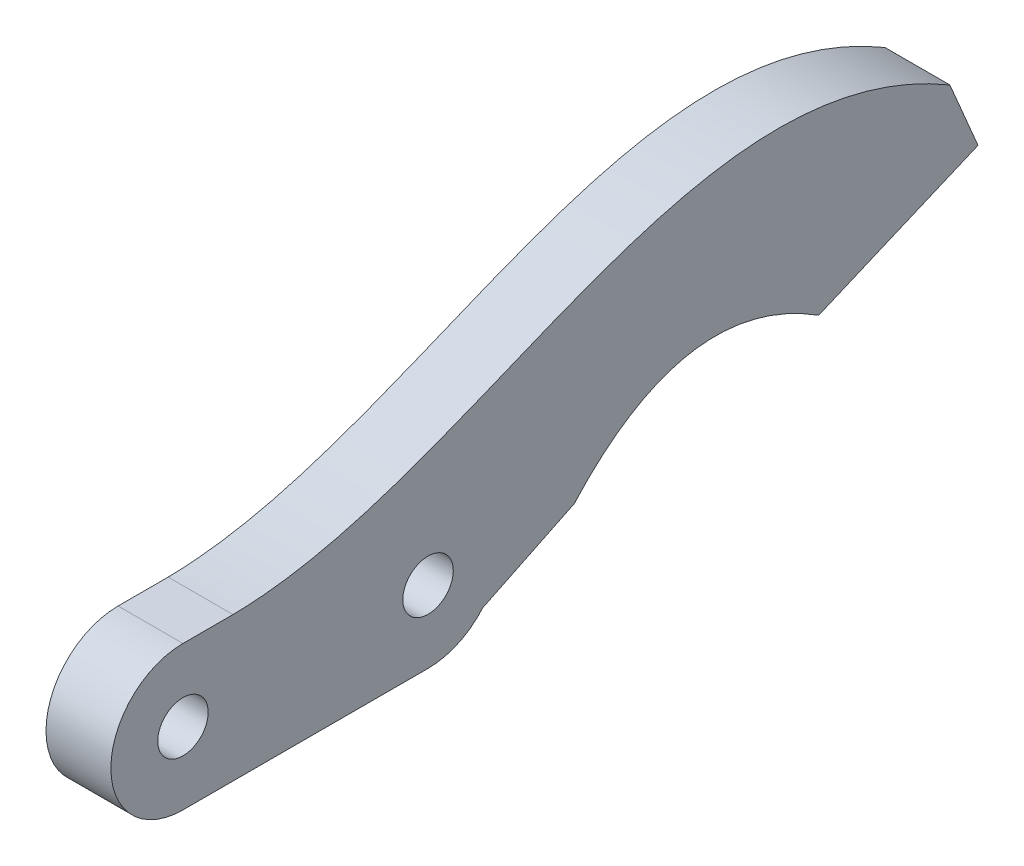
ISO-10303-21;
HEADER;
FILE_DESCRIPTION(('STEP AP214'),'2;1');
FILE_NAME('part.step','',(''),(''),'','','');
FILE_SCHEMA(('AUTOMOTIVE_DESIGN { 1 0 10303 214 1 1 1 1 }'));
ENDSEC;
DATA;
#1=APPLICATION_CONTEXT('core data for automotive mechanical design processes');
#2=APPLICATION_PROTOCOL_DEFINITION('international standard','automotive_design',2000,#1);
#3=PRODUCT_CONTEXT('',#1,'mechanical');
#4=PRODUCT('Part','Part','',(#3));
#5=PRODUCT_RELATED_PRODUCT_CATEGORY('part','',(#4));
#6=PRODUCT_DEFINITION_FORMATION('','',#4);
#7=PRODUCT_DEFINITION_CONTEXT('part definition',#1,'design');
#8=PRODUCT_DEFINITION('design','',#6,#7);
#9=PRODUCT_DEFINITION_SHAPE('','',#8);
#10=(LENGTH_UNIT() NAMED_UNIT(*) SI_UNIT(.MILLI.,.METRE.));
#11=(NAMED_UNIT(*) PLANE_ANGLE_UNIT() SI_UNIT($,.RADIAN.));
#12=(NAMED_UNIT(*) SI_UNIT($,.STERADIAN.) SOLID_ANGLE_UNIT());
#13=UNCERTAINTY_MEASURE_WITH_UNIT(LENGTH_MEASURE(1.E-05),#10,'distance_accuracy_value','');
#14=(GEOMETRIC_REPRESENTATION_CONTEXT(3) GLOBAL_UNCERTAINTY_ASSIGNED_CONTEXT((#13)) GLOBAL_UNIT_ASSIGNED_CONTEXT((#10,
#11,#12)) REPRESENTATION_CONTEXT('',''));
#15=CARTESIAN_POINT('',(0.,0.,0.));
#16=DIRECTION('',(0.,0.,1.));
#17=DIRECTION('',(1.,0.,0.));
#18=AXIS2_PLACEMENT_3D('',#15,#16,#17);
#19=CARTESIAN_POINT('',(4.5,10.,0.));
#20=DIRECTION('',(0.,1.,0.));
#21=DIRECTION('',(0.,0.,1.));
#22=AXIS2_PLACEMENT_3D('',#19,#20,#21);
#23=PLANE('',#22);
#24=DIRECTION('',(1.,0.,0.));
#25=VECTOR('',#24,1.);
#26=CARTESIAN_POINT('',(0.,10.,-8.4718759220508));
#27=LINE('',#26,#25);
#28=CARTESIAN_POINT('',(0.,10.,-8.4718759220508));
#29=VERTEX_POINT('',#28);
#30=CARTESIAN_POINT('',(4.5,10.,-8.4718759220508));
#31=VERTEX_POINT('',#30);
#32=EDGE_CURVE('E134',#29,#31,#27,.T.);
#33=ORIENTED_EDGE('',*,*,#32,.F.);
#34=DIRECTION('',(0.,0.,-1.));
#35=VECTOR('',#34,1.);
#36=CARTESIAN_POINT('',(0.,10.,0.));
#37=LINE('',#36,#35);
#38=CARTESIAN_POINT('',(0.,10.,-5.));
#39=VERTEX_POINT('',#38);
#40=EDGE_CURVE('E145',#39,#29,#37,.T.);
#41=ORIENTED_EDGE('',*,*,#40,.F.);
#42=DIRECTION('',(-1.,0.,0.));
#43=VECTOR('',#42,1.);
#44=CARTESIAN_POINT('',(4.5,10.,-5.));
#45=LINE('',#44,#43);
#46=CARTESIAN_POINT('',(4.5,10.,-5.));
#47=VERTEX_POINT('',#46);
#48=EDGE_CURVE('E11',#47,#39,#45,.T.);
#49=ORIENTED_EDGE('',*,*,#48,.F.);
#50=DIRECTION('',(0.,0.,-1.));
#51=VECTOR('',#50,1.);
#52=CARTESIAN_POINT('',(4.5,10.,0.));
#53=LINE('',#52,#51);
#54=EDGE_CURVE('E202',#47,#31,#53,.T.);
#55=ORIENTED_EDGE('',*,*,#54,.T.);
#56=EDGE_LOOP('',(#33,#41,#49,#55));
#57=FACE_BOUND('',#56,.T.);
#58=ADVANCED_FACE('F43',(#57),#23,.T.);
#59=CARTESIAN_POINT('',(4.5,5.,-5.));
#60=DIRECTION('',(-1.,0.,0.));
#61=DIRECTION('',(0.,0.,1.));
#62=AXIS2_PLACEMENT_3D('',#59,#60,#61);
#63=CYLINDRICAL_SURFACE('',#62,5.);
#64=CARTESIAN_POINT('',(0.,5.,-5.));
#65=DIRECTION('',(1.,0.,0.));
#66=DIRECTION('',(0.,0.,-1.));
#67=AXIS2_PLACEMENT_3D('',#64,#65,#66);
#68=CIRCLE('',#67,5.);
#69=CARTESIAN_POINT('',(0.,0.,-5.));
#70=VERTEX_POINT('',#69);
#71=EDGE_CURVE('E73',#39,#70,#68,.T.);
#72=ORIENTED_EDGE('',*,*,#71,.T.);
#73=DIRECTION('',(-1.,0.,0.));
#74=VECTOR('',#73,1.);
#75=CARTESIAN_POINT('',(4.5,0.,-5.));
#76=LINE('',#75,#74);
#77=CARTESIAN_POINT('',(4.5,0.,-5.));
#78=VERTEX_POINT('',#77);
#79=EDGE_CURVE('E52',#78,#70,#76,.T.);
#80=ORIENTED_EDGE('',*,*,#79,.F.);
#81=CARTESIAN_POINT('',(4.5,5.,-5.));
#82=DIRECTION('',(1.,0.,0.));
#83=DIRECTION('',(0.,0.,-1.));
#84=AXIS2_PLACEMENT_3D('',#81,#82,#83);
#85=CIRCLE('',#84,5.);
#86=EDGE_CURVE('E214',#47,#78,#85,.T.);
#87=ORIENTED_EDGE('',*,*,#86,.F.);
#88=ORIENTED_EDGE('',*,*,#48,.T.);
#89=EDGE_LOOP('',(#72,#80,#87,#88));
#90=FACE_BOUND('',#89,.T.);
#91=ADVANCED_FACE('F194',(#90),#63,.T.);
#92=CARTESIAN_POINT('',(4.5,0.,0.));
#93=DIRECTION('',(0.,1.,0.));
#94=DIRECTION('',(0.,0.,1.));
#95=AXIS2_PLACEMENT_3D('',#92,#93,#94);
#96=PLANE('',#95);
#97=DIRECTION('',(0.,0.,-1.));
#98=VECTOR('',#97,1.);
#99=CARTESIAN_POINT('',(0.,0.,0.));
#100=LINE('',#99,#98);
#101=CARTESIAN_POINT('',(0.,0.,-22.));
#102=VERTEX_POINT('',#101);
#103=EDGE_CURVE('E78',#70,#102,#100,.T.);
#104=ORIENTED_EDGE('',*,*,#103,.T.);
#105=DIRECTION('',(-1.,0.,0.));
#106=VECTOR('',#105,1.);
#107=CARTESIAN_POINT('',(4.5,0.,-22.));
#108=LINE('',#107,#106);
#109=CARTESIAN_POINT('',(4.5,0.,-22.));
#110=VERTEX_POINT('',#109);
#111=EDGE_CURVE('E231',#110,#102,#108,.T.);
#112=ORIENTED_EDGE('',*,*,#111,.F.);
#113=DIRECTION('',(0.,0.,-1.));
#114=VECTOR('',#113,1.);
#115=CARTESIAN_POINT('',(4.5,0.,0.));
#116=LINE('',#115,#114);
#117=EDGE_CURVE('E60',#78,#110,#116,.T.);
#118=ORIENTED_EDGE('',*,*,#117,.F.);
#119=ORIENTED_EDGE('',*,*,#79,.T.);
#120=EDGE_LOOP('',(#104,#112,#118,#119));
#121=FACE_BOUND('',#120,.T.);
#122=ADVANCED_FACE('F188',(#121),#96,.F.);
#123=CARTESIAN_POINT('',(4.5,5.,-5.));
#124=DIRECTION('',(-1.,0.,0.));
#125=DIRECTION('',(0.,0.,1.));
#126=AXIS2_PLACEMENT_3D('',#123,#124,#125);
#127=CYLINDRICAL_SURFACE('',#126,1.75);
#128=CARTESIAN_POINT('',(4.5,5.,-5.));
#129=DIRECTION('',(1.,0.,0.));
#130=DIRECTION('',(0.,0.,-1.));
#131=AXIS2_PLACEMENT_3D('',#128,#129,#130);
#132=CIRCLE('',#131,1.75);
#133=CARTESIAN_POINT('',(4.5,5.,-6.75));
#134=VERTEX_POINT('',#133);
#135=EDGE_CURVE('E223',#134,#134,#132,.T.);
#136=ORIENTED_EDGE('',*,*,#135,.T.);
#137=EDGE_LOOP('',(#136));
#138=FACE_BOUND('',#137,.T.);
#139=CARTESIAN_POINT('',(0.,5.,-5.));
#140=DIRECTION('',(1.,0.,0.));
#141=DIRECTION('',(0.,0.,-1.));
#142=AXIS2_PLACEMENT_3D('',#139,#140,#141);
#143=CIRCLE('',#142,1.75);
#144=CARTESIAN_POINT('',(0.,5.,-6.75));
#145=VERTEX_POINT('',#144);
#146=EDGE_CURVE('E242',#145,#145,#143,.T.);
#147=ORIENTED_EDGE('',*,*,#146,.F.);
#148=EDGE_LOOP('',(#147));
#149=FACE_BOUND('',#148,.T.);
#150=ADVANCED_FACE('F185',(#138,#149),#127,.F.);
#151=CARTESIAN_POINT('',(4.5,5.,-22.));
#152=DIRECTION('',(-1.,0.,0.));
#153=DIRECTION('',(0.,0.,1.));
#154=AXIS2_PLACEMENT_3D('',#151,#152,#153);
#155=CYLINDRICAL_SURFACE('',#154,5.);
#156=CARTESIAN_POINT('',(0.,5.,-22.));
#157=DIRECTION('',(1.,0.,0.));
#158=DIRECTION('',(0.,0.,-1.));
#159=AXIS2_PLACEMENT_3D('',#156,#157,#158);
#160=CIRCLE('',#159,5.);
#161=CARTESIAN_POINT('',(0.,1.74538296746678,-25.7957170563076));
#162=VERTEX_POINT('',#161);
#163=EDGE_CURVE('E238',#102,#162,#160,.T.);
#164=ORIENTED_EDGE('',*,*,#163,.T.);
#165=DIRECTION('',(1.,0.,0.));
#166=VECTOR('',#165,1.);
#167=CARTESIAN_POINT('',(0.,1.74538296746678,-25.7957170563076));
#168=LINE('',#167,#166);
#169=CARTESIAN_POINT('',(4.5,1.74538296746678,-25.7957170563076));
#170=VERTEX_POINT('',#169);
#171=EDGE_CURVE('E204',#162,#170,#168,.T.);
#172=ORIENTED_EDGE('',*,*,#171,.T.);
#173=CARTESIAN_POINT('',(4.5,5.,-22.));
#174=DIRECTION('',(1.,0.,0.));
#175=DIRECTION('',(0.,0.,-1.));
#176=AXIS2_PLACEMENT_3D('',#173,#174,#175);
#177=CIRCLE('',#176,5.);
#178=EDGE_CURVE('E220',#110,#170,#177,.T.);
#179=ORIENTED_EDGE('',*,*,#178,.F.);
#180=ORIENTED_EDGE('',*,*,#111,.T.);
#181=EDGE_LOOP('',(#164,#172,#179,#180));
#182=FACE_BOUND('',#181,.T.);
#183=ADVANCED_FACE('F183',(#182),#155,.T.);
#184=CARTESIAN_POINT('',(4.5,5.,-22.));
#185=DIRECTION('',(-1.,0.,0.));
#186=DIRECTION('',(0.,0.,1.));
#187=AXIS2_PLACEMENT_3D('',#184,#185,#186);
#188=CYLINDRICAL_SURFACE('',#187,1.75);
#189=CARTESIAN_POINT('',(4.5,5.,-22.));
#190=DIRECTION('',(1.,0.,0.));
#191=DIRECTION('',(0.,0.,-1.));
#192=AXIS2_PLACEMENT_3D('',#189,#190,#191);
#193=CIRCLE('',#192,1.75);
#194=CARTESIAN_POINT('',(4.5,5.,-23.75));
#195=VERTEX_POINT('',#194);
#196=EDGE_CURVE('E227',#195,#195,#193,.T.);
#197=ORIENTED_EDGE('',*,*,#196,.T.);
#198=EDGE_LOOP('',(#197));
#199=FACE_BOUND('',#198,.T.);
#200=CARTESIAN_POINT('',(0.,5.,-22.));
#201=DIRECTION('',(1.,0.,0.));
#202=DIRECTION('',(0.,0.,-1.));
#203=AXIS2_PLACEMENT_3D('',#200,#201,#202);
#204=CIRCLE('',#203,1.75);
#205=CARTESIAN_POINT('',(0.,5.,-23.75));
#206=VERTEX_POINT('',#205);
#207=EDGE_CURVE('E215',#206,#206,#204,.T.);
#208=ORIENTED_EDGE('',*,*,#207,.F.);
#209=EDGE_LOOP('',(#208));
#210=FACE_BOUND('',#209,.T.);
#211=ADVANCED_FACE('F178',(#199,#210),#188,.F.);
#212=CARTESIAN_POINT('',(4.5,0.,0.));
#213=DIRECTION('',(1.,0.,0.));
#214=DIRECTION('',(0.,0.,-1.));
#215=AXIS2_PLACEMENT_3D('',#212,#213,#214);
#216=PLANE('',#215);
#217=ORIENTED_EDGE('',*,*,#54,.F.);
#218=ORIENTED_EDGE('',*,*,#86,.T.);
#219=ORIENTED_EDGE('',*,*,#117,.T.);
#220=ORIENTED_EDGE('',*,*,#178,.T.);
#221=DIRECTION('',(0.,0.436767415089167,-0.8995744689109));
#222=VECTOR('',#221,1.);
#223=CARTESIAN_POINT('',(4.5,-8.72283781662342,-4.23517058017573));
#224=LINE('',#223,#222);
#225=CARTESIAN_POINT('',(4.5,4.82408407678908,-32.1366683719835));
#226=VERTEX_POINT('',#225);
#227=EDGE_CURVE('E259',#170,#226,#224,.T.);
#228=ORIENTED_EDGE('',*,*,#227,.T.);
#229=CARTESIAN_POINT('',(4.5,4.82408407678908,-32.1366683719835));
#230=CARTESIAN_POINT('',(4.5,13.4817091615322,-39.9304755950713));
#231=CARTESIAN_POINT('',(4.5,7.66555394142848,-49.0967621819642));
#232=B_SPLINE_CURVE_WITH_KNOTS('',2,(#229,#230,#231),.UNSPECIFIED.,.F.,.F.,(3,3),(0.,1.),.UNSPECIFIED.);
#233=CARTESIAN_POINT('',(4.5,7.66555394142848,-49.0967621819642));
#234=VERTEX_POINT('',#233);
#235=EDGE_CURVE('E156',#226,#234,#232,.T.);
#236=ORIENTED_EDGE('',*,*,#235,.T.);
#237=DIRECTION('',(0.,0.390209351183373,-0.92072616029363));
#238=VECTOR('',#237,1.);
#239=CARTESIAN_POINT('',(4.5,-11.1409151366516,-4.72158764955199));
#240=LINE('',#239,#238);
#241=CARTESIAN_POINT('',(4.5,12.348066155629,-60.1454761054878));
#242=VERTEX_POINT('',#241);
#243=EDGE_CURVE('E152',#234,#242,#240,.T.);
#244=ORIENTED_EDGE('',*,*,#243,.T.);
#245=DIRECTION('',(0.,0.92072616029363,0.390209351183373));
#246=VECTOR('',#245,1.);
#247=CARTESIAN_POINT('',(4.5,23.4889812922805,-55.4238884559358));
#248=LINE('',#247,#246);
#249=CARTESIAN_POINT('',(4.5,16.9516969570971,-58.1944293495709));
#250=VERTEX_POINT('',#249);
#251=EDGE_CURVE('E268',#242,#250,#248,.T.);
#252=ORIENTED_EDGE('',*,*,#251,.T.);
#253=CARTESIAN_POINT('',(4.5,16.9516969570971,-58.1944293495709));
#254=CARTESIAN_POINT('',(4.5,27.4751352014703,-40.4171561121551));
#255=CARTESIAN_POINT('',(4.5,9.75391621034612,-25.2285315852964));
#256=CARTESIAN_POINT('',(4.5,10.,-7.74622247075814));
#257=B_SPLINE_CURVE_WITH_KNOTS('',3,(#253,#254,#255,#256),.UNSPECIFIED.,.F.,.F.,(4,4),(0.,1.),.UNSPECIFIED.);
#258=EDGE_CURVE('E128',#250,#31,#257,.T.);
#259=ORIENTED_EDGE('',*,*,#258,.T.);
#260=EDGE_LOOP('',(#217,#218,#219,#220,#228,#236,#244,#252,#259));
#261=FACE_BOUND('',#260,.T.);
#262=ORIENTED_EDGE('',*,*,#135,.F.);
#263=EDGE_LOOP('',(#262));
#264=FACE_BOUND('',#263,.T.);
#265=ORIENTED_EDGE('',*,*,#196,.F.);
#266=EDGE_LOOP('',(#265));
#267=FACE_BOUND('',#266,.T.);
#268=ADVANCED_FACE('F175',(#261,#264,#267),#216,.T.);
#269=CARTESIAN_POINT('',(0.,0.,0.));
#270=DIRECTION('',(1.,0.,0.));
#271=DIRECTION('',(0.,0.,-1.));
#272=AXIS2_PLACEMENT_3D('',#269,#270,#271);
#273=PLANE('',#272);
#274=ORIENTED_EDGE('',*,*,#40,.T.);
#275=CARTESIAN_POINT('',(0.,16.9516969570971,-58.1944293495709));
#276=CARTESIAN_POINT('',(0.,27.4751352014703,-40.4171561121551));
#277=CARTESIAN_POINT('',(0.,9.75391621034612,-25.2285315852964));
#278=CARTESIAN_POINT('',(0.,10.,-7.74622247075814));
#279=B_SPLINE_CURVE_WITH_KNOTS('',3,(#275,#276,#277,#278),.UNSPECIFIED.,.F.,.F.,(4,4),(0.,1.),.UNSPECIFIED.);
#280=CARTESIAN_POINT('',(0.,16.9516969570971,-58.1944293495709));
#281=VERTEX_POINT('',#280);
#282=EDGE_CURVE('E125',#281,#29,#279,.T.);
#283=ORIENTED_EDGE('',*,*,#282,.F.);
#284=DIRECTION('',(0.,0.92072616029363,0.390209351183373));
#285=VECTOR('',#284,1.);
#286=CARTESIAN_POINT('',(0.,23.4889812922805,-55.4238884559358));
#287=LINE('',#286,#285);
#288=CARTESIAN_POINT('',(0.,12.348066155629,-60.1454761054878));
#289=VERTEX_POINT('',#288);
#290=EDGE_CURVE('E143',#289,#281,#287,.T.);
#291=ORIENTED_EDGE('',*,*,#290,.F.);
#292=DIRECTION('',(0.,0.390209351183373,-0.92072616029363));
#293=VECTOR('',#292,1.);
#294=CARTESIAN_POINT('',(0.,-11.1409151366516,-4.72158764955199));
#295=LINE('',#294,#293);
#296=CARTESIAN_POINT('',(0.,7.66555394142848,-49.0967621819642));
#297=VERTEX_POINT('',#296);
#298=EDGE_CURVE('E135',#297,#289,#295,.T.);
#299=ORIENTED_EDGE('',*,*,#298,.F.);
#300=CARTESIAN_POINT('',(0.,4.82408407678908,-32.1366683719835));
#301=CARTESIAN_POINT('',(0.,13.4817091615322,-39.9304755950713));
#302=CARTESIAN_POINT('',(0.,7.66555394142848,-49.0967621819642));
#303=B_SPLINE_CURVE_WITH_KNOTS('',2,(#300,#301,#302),.UNSPECIFIED.,.F.,.F.,(3,3),(0.,1.),.UNSPECIFIED.);
#304=CARTESIAN_POINT('',(0.,4.82408407678908,-32.1366683719835));
#305=VERTEX_POINT('',#304);
#306=EDGE_CURVE('E287',#305,#297,#303,.T.);
#307=ORIENTED_EDGE('',*,*,#306,.F.);
#308=DIRECTION('',(0.,0.436767415089167,-0.8995744689109));
#309=VECTOR('',#308,1.);
#310=CARTESIAN_POINT('',(0.,-8.72283781662342,-4.23517058017573));
#311=LINE('',#310,#309);
#312=EDGE_CURVE('E147',#162,#305,#311,.T.);
#313=ORIENTED_EDGE('',*,*,#312,.F.);
#314=ORIENTED_EDGE('',*,*,#163,.F.);
#315=ORIENTED_EDGE('',*,*,#103,.F.);
#316=ORIENTED_EDGE('',*,*,#71,.F.);
#317=EDGE_LOOP('',(#274,#283,#291,#299,#307,#313,#314,#315,#316));
#318=FACE_BOUND('',#317,.T.);
#319=ORIENTED_EDGE('',*,*,#146,.T.);
#320=EDGE_LOOP('',(#319));
#321=FACE_BOUND('',#320,.T.);
#322=ORIENTED_EDGE('',*,*,#207,.T.);
#323=EDGE_LOOP('',(#322));
#324=FACE_BOUND('',#323,.T.);
#325=ADVANCED_FACE('F140',(#318,#321,#324),#273,.F.);
#326=CARTESIAN_POINT('',(0.,23.4889812922805,-55.4238884559358));
#327=DIRECTION('',(0.,0.390209351183373,-0.92072616029363));
#328=DIRECTION('',(0.,0.92072616029363,0.390209351183373));
#329=AXIS2_PLACEMENT_3D('',#326,#327,#328);
#330=PLANE('',#329);
#331=ORIENTED_EDGE('',*,*,#251,.F.);
#332=DIRECTION('',(1.,0.,0.));
#333=VECTOR('',#332,1.);
#334=CARTESIAN_POINT('',(0.,12.348066155629,-60.1454761054878));
#335=LINE('',#334,#333);
#336=EDGE_CURVE('E150',#289,#242,#335,.T.);
#337=ORIENTED_EDGE('',*,*,#336,.F.);
#338=ORIENTED_EDGE('',*,*,#290,.T.);
#339=DIRECTION('',(1.,0.,0.));
#340=VECTOR('',#339,1.);
#341=CARTESIAN_POINT('',(0.,16.9516969570971,-58.1944293495709));
#342=LINE('',#341,#340);
#343=EDGE_CURVE('E122',#281,#250,#342,.T.);
#344=ORIENTED_EDGE('',*,*,#343,.T.);
#345=EDGE_LOOP('',(#331,#337,#338,#344));
#346=FACE_BOUND('',#345,.T.);
#347=ADVANCED_FACE('F149',(#346),#330,.T.);
#348=CARTESIAN_POINT('',(0.,-11.1409151366516,-4.72158764955199));
#349=DIRECTION('',(0.,-0.92072616029363,-0.390209351183373));
#350=DIRECTION('',(0.,0.390209351183373,-0.92072616029363));
#351=AXIS2_PLACEMENT_3D('',#348,#349,#350);
#352=PLANE('',#351);
#353=ORIENTED_EDGE('',*,*,#243,.F.);
#354=DIRECTION('',(1.,0.,0.));
#355=VECTOR('',#354,1.);
#356=CARTESIAN_POINT('',(0.,7.66555394142848,-49.0967621819642));
#357=LINE('',#356,#355);
#358=EDGE_CURVE('E281',#297,#234,#357,.T.);
#359=ORIENTED_EDGE('',*,*,#358,.F.);
#360=ORIENTED_EDGE('',*,*,#298,.T.);
#361=ORIENTED_EDGE('',*,*,#336,.T.);
#362=EDGE_LOOP('',(#353,#359,#360,#361));
#363=FACE_BOUND('',#362,.T.);
#364=ADVANCED_FACE('F174',(#363),#352,.T.);
#365=DIRECTION('',(1.,0.,0.));
#366=VECTOR('',#365,1.);
#367=SURFACE_OF_LINEAR_EXTRUSION('',#303,#366);
#368=ORIENTED_EDGE('',*,*,#235,.F.);
#369=DIRECTION('',(1.,0.,0.));
#370=VECTOR('',#369,1.);
#371=CARTESIAN_POINT('',(0.,4.82408407678908,-32.1366683719835));
#372=LINE('',#371,#370);
#373=EDGE_CURVE('E208',#305,#226,#372,.T.);
#374=ORIENTED_EDGE('',*,*,#373,.F.);
#375=ORIENTED_EDGE('',*,*,#306,.T.);
#376=ORIENTED_EDGE('',*,*,#358,.T.);
#377=EDGE_LOOP('',(#368,#374,#375,#376));
#378=FACE_BOUND('',#377,.T.);
#379=ADVANCED_FACE('F286',(#378),#367,.T.);
#380=CARTESIAN_POINT('',(0.,-8.72283781662342,-4.23517058017573));
#381=DIRECTION('',(0.,-0.8995744689109,-0.436767415089167));
#382=DIRECTION('',(0.,0.436767415089167,-0.8995744689109));
#383=AXIS2_PLACEMENT_3D('',#380,#381,#382);
#384=PLANE('',#383);
#385=ORIENTED_EDGE('',*,*,#227,.F.);
#386=ORIENTED_EDGE('',*,*,#171,.F.);
#387=ORIENTED_EDGE('',*,*,#312,.T.);
#388=ORIENTED_EDGE('',*,*,#373,.T.);
#389=EDGE_LOOP('',(#385,#386,#387,#388));
#390=FACE_BOUND('',#389,.T.);
#391=ADVANCED_FACE('F170',(#390),#384,.T.);
#392=DIRECTION('',(1.,0.,0.));
#393=VECTOR('',#392,1.);
#394=SURFACE_OF_LINEAR_EXTRUSION('',#279,#393);
#395=ORIENTED_EDGE('',*,*,#258,.F.);
#396=ORIENTED_EDGE('',*,*,#343,.F.);
#397=ORIENTED_EDGE('',*,*,#282,.T.);
#398=ORIENTED_EDGE('',*,*,#32,.T.);
#399=EDGE_LOOP('',(#395,#396,#397,#398));
#400=FACE_BOUND('',#399,.T.);
#401=ADVANCED_FACE('F124',(#400),#394,.T.);
#402=CLOSED_SHELL('',(#58,#91,#122,#150,#183,#211,#268,#325,#347,#364,#379,#391,#401));
#403=MANIFOLD_SOLID_BREP('B2',#402);
#404=ADVANCED_BREP_SHAPE_REPRESENTATION('',(#18,#403),#14);
#405=SHAPE_DEFINITION_REPRESENTATION(#9,#404);
ENDSEC;
END-ISO-10303-21;
